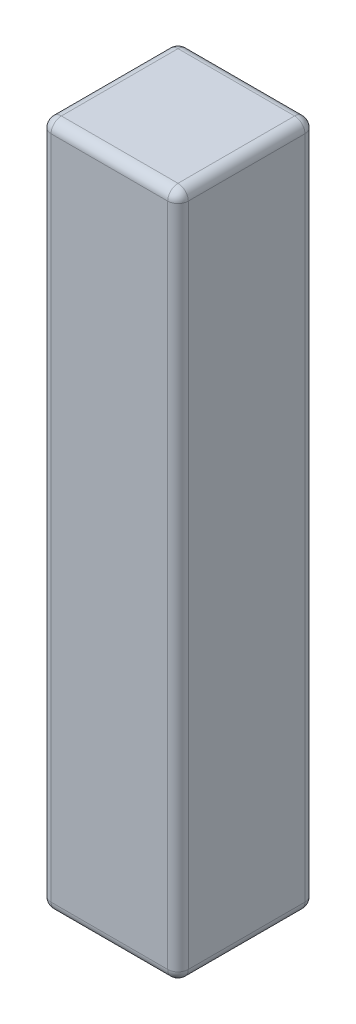
ISO-10303-21;
HEADER;
FILE_DESCRIPTION(('STEP AP214'),'2;1');
FILE_NAME('part.step','',(''),(''),'','','');
FILE_SCHEMA(('AUTOMOTIVE_DESIGN { 1 0 10303 214 1 1 1 1 }'));
ENDSEC;
DATA;
#1=APPLICATION_CONTEXT('core data for automotive mechanical design processes');
#2=APPLICATION_PROTOCOL_DEFINITION('international standard','automotive_design',2000,#1);
#3=PRODUCT_CONTEXT('',#1,'mechanical');
#4=PRODUCT('Part','Part','',(#3));
#5=PRODUCT_RELATED_PRODUCT_CATEGORY('part','',(#4));
#6=PRODUCT_DEFINITION_FORMATION('','',#4);
#7=PRODUCT_DEFINITION_CONTEXT('part definition',#1,'design');
#8=PRODUCT_DEFINITION('design','',#6,#7);
#9=PRODUCT_DEFINITION_SHAPE('','',#8);
#10=(LENGTH_UNIT() NAMED_UNIT(*) SI_UNIT(.MILLI.,.METRE.));
#11=(NAMED_UNIT(*) PLANE_ANGLE_UNIT() SI_UNIT($,.RADIAN.));
#12=(NAMED_UNIT(*) SI_UNIT($,.STERADIAN.) SOLID_ANGLE_UNIT());
#13=UNCERTAINTY_MEASURE_WITH_UNIT(LENGTH_MEASURE(1.E-05),#10,'distance_accuracy_value','');
#14=(GEOMETRIC_REPRESENTATION_CONTEXT(3) GLOBAL_UNCERTAINTY_ASSIGNED_CONTEXT((#13)) GLOBAL_UNIT_ASSIGNED_CONTEXT((#10,
#11,#12)) REPRESENTATION_CONTEXT('',''));
#15=CARTESIAN_POINT('',(0.,0.,0.));
#16=DIRECTION('',(0.,0.,1.));
#17=DIRECTION('',(1.,0.,0.));
#18=AXIS2_PLACEMENT_3D('',#15,#16,#17);
#19=CARTESIAN_POINT('',(-1.00000054,5.,-1.00000054));
#20=DIRECTION('',(1.,0.,0.));
#21=DIRECTION('',(0.,0.,-1.));
#22=AXIS2_PLACEMENT_3D('',#19,#20,#21);
#23=PLANE('',#22);
#24=DIRECTION('',(0.,-1.,0.));
#25=VECTOR('',#24,1.);
#26=CARTESIAN_POINT('',(-1.00000054,5.,0.85000054));
#27=LINE('',#26,#25);
#28=CARTESIAN_POINT('',(-1.00000054,-4.85,0.85000054));
#29=VERTEX_POINT('',#28);
#30=CARTESIAN_POINT('',(-1.00000054,4.85,0.85000054));
#31=VERTEX_POINT('',#30);
#32=EDGE_CURVE('E218',#29,#31,#27,.F.);
#33=ORIENTED_EDGE('',*,*,#32,.T.);
#34=DIRECTION('',(0.,0.,1.));
#35=VECTOR('',#34,1.);
#36=CARTESIAN_POINT('',(-1.00000054,4.85,-1.00000054));
#37=LINE('',#36,#35);
#38=CARTESIAN_POINT('',(-1.00000054,4.85,-0.85000054));
#39=VERTEX_POINT('',#38);
#40=EDGE_CURVE('E221',#31,#39,#37,.F.);
#41=ORIENTED_EDGE('',*,*,#40,.T.);
#42=DIRECTION('',(0.,-1.,0.));
#43=VECTOR('',#42,1.);
#44=CARTESIAN_POINT('',(-1.00000054,5.,-0.85000054));
#45=LINE('',#44,#43);
#46=CARTESIAN_POINT('',(-1.00000054,-4.85,-0.85000054));
#47=VERTEX_POINT('',#46);
#48=EDGE_CURVE('E219',#39,#47,#45,.T.);
#49=ORIENTED_EDGE('',*,*,#48,.T.);
#50=DIRECTION('',(0.,0.,1.));
#51=VECTOR('',#50,1.);
#52=CARTESIAN_POINT('',(-1.00000054,-4.85,-1.00000054));
#53=LINE('',#52,#51);
#54=EDGE_CURVE('E215',#47,#29,#53,.T.);
#55=ORIENTED_EDGE('',*,*,#54,.T.);
#56=EDGE_LOOP('',(#33,#41,#49,#55));
#57=FACE_BOUND('',#56,.T.);
#58=ADVANCED_FACE('F36',(#57),#23,.F.);
#59=CARTESIAN_POINT('',(-1.00000054,5.,1.00000054));
#60=DIRECTION('',(0.,0.,-1.));
#61=DIRECTION('',(-1.,0.,0.));
#62=AXIS2_PLACEMENT_3D('',#59,#60,#61);
#63=PLANE('',#62);
#64=DIRECTION('',(1.,0.,0.));
#65=VECTOR('',#64,1.);
#66=CARTESIAN_POINT('',(-1.00000054,-4.85,1.00000054));
#67=LINE('',#66,#65);
#68=CARTESIAN_POINT('',(-0.85000054,-4.85,1.00000054));
#69=VERTEX_POINT('',#68);
#70=CARTESIAN_POINT('',(0.85000054,-4.85,1.00000054));
#71=VERTEX_POINT('',#70);
#72=EDGE_CURVE('E259',#69,#71,#67,.T.);
#73=ORIENTED_EDGE('',*,*,#72,.T.);
#74=DIRECTION('',(0.,-1.,0.));
#75=VECTOR('',#74,1.);
#76=CARTESIAN_POINT('',(0.85000054,5.,1.00000054));
#77=LINE('',#76,#75);
#78=CARTESIAN_POINT('',(0.85000054,4.85,1.00000054));
#79=VERTEX_POINT('',#78);
#80=EDGE_CURVE('E265',#71,#79,#77,.F.);
#81=ORIENTED_EDGE('',*,*,#80,.T.);
#82=DIRECTION('',(1.,0.,0.));
#83=VECTOR('',#82,1.);
#84=CARTESIAN_POINT('',(-1.00000054,4.85,1.00000054));
#85=LINE('',#84,#83);
#86=CARTESIAN_POINT('',(-0.85000054,4.85,1.00000054));
#87=VERTEX_POINT('',#86);
#88=EDGE_CURVE('E262',#79,#87,#85,.F.);
#89=ORIENTED_EDGE('',*,*,#88,.T.);
#90=DIRECTION('',(0.,-1.,0.));
#91=VECTOR('',#90,1.);
#92=CARTESIAN_POINT('',(-0.85000054,5.,1.00000054));
#93=LINE('',#92,#91);
#94=EDGE_CURVE('E254',#87,#69,#93,.T.);
#95=ORIENTED_EDGE('',*,*,#94,.T.);
#96=EDGE_LOOP('',(#73,#81,#89,#95));
#97=FACE_BOUND('',#96,.T.);
#98=ADVANCED_FACE('F263',(#97),#63,.F.);
#99=CARTESIAN_POINT('',(1.00000054,5.,-1.00000054));
#100=DIRECTION('',(-1.,0.,0.));
#101=DIRECTION('',(0.,0.,1.));
#102=AXIS2_PLACEMENT_3D('',#99,#100,#101);
#103=PLANE('',#102);
#104=DIRECTION('',(0.,0.,-1.));
#105=VECTOR('',#104,1.);
#106=CARTESIAN_POINT('',(1.00000054,4.85,1.00000054));
#107=LINE('',#106,#105);
#108=CARTESIAN_POINT('',(1.00000054,4.85,-0.85000054));
#109=VERTEX_POINT('',#108);
#110=CARTESIAN_POINT('',(1.00000054,4.85,0.85000054));
#111=VERTEX_POINT('',#110);
#112=EDGE_CURVE('E155',#109,#111,#107,.F.);
#113=ORIENTED_EDGE('',*,*,#112,.T.);
#114=DIRECTION('',(0.,-1.,0.));
#115=VECTOR('',#114,1.);
#116=CARTESIAN_POINT('',(1.00000054,5.,0.85000054));
#117=LINE('',#116,#115);
#118=CARTESIAN_POINT('',(1.00000054,-4.85,0.85000054));
#119=VERTEX_POINT('',#118);
#120=EDGE_CURVE('E223',#111,#119,#117,.T.);
#121=ORIENTED_EDGE('',*,*,#120,.T.);
#122=DIRECTION('',(0.,0.,-1.));
#123=VECTOR('',#122,1.);
#124=CARTESIAN_POINT('',(1.00000054,-4.85,-1.00000054));
#125=LINE('',#124,#123);
#126=CARTESIAN_POINT('',(1.00000054,-4.85,-0.85000054));
#127=VERTEX_POINT('',#126);
#128=EDGE_CURVE('E282',#119,#127,#125,.T.);
#129=ORIENTED_EDGE('',*,*,#128,.T.);
#130=DIRECTION('',(0.,-1.,0.));
#131=VECTOR('',#130,1.);
#132=CARTESIAN_POINT('',(1.00000054,5.,-0.85000054));
#133=LINE('',#132,#131);
#134=EDGE_CURVE('E280',#127,#109,#133,.F.);
#135=ORIENTED_EDGE('',*,*,#134,.T.);
#136=EDGE_LOOP('',(#113,#121,#129,#135));
#137=FACE_BOUND('',#136,.T.);
#138=ADVANCED_FACE('F287',(#137),#103,.F.);
#139=CARTESIAN_POINT('',(-1.00000054,5.,-1.00000054));
#140=DIRECTION('',(0.,0.,1.));
#141=DIRECTION('',(1.,0.,0.));
#142=AXIS2_PLACEMENT_3D('',#139,#140,#141);
#143=PLANE('',#142);
#144=DIRECTION('',(-1.,0.,0.));
#145=VECTOR('',#144,1.);
#146=CARTESIAN_POINT('',(1.00000054,4.85,-1.00000054));
#147=LINE('',#146,#145);
#148=CARTESIAN_POINT('',(-0.85000054,4.85,-1.00000054));
#149=VERTEX_POINT('',#148);
#150=CARTESIAN_POINT('',(0.85000054,4.85,-1.00000054));
#151=VERTEX_POINT('',#150);
#152=EDGE_CURVE('E45',#149,#151,#147,.F.);
#153=ORIENTED_EDGE('',*,*,#152,.T.);
#154=DIRECTION('',(0.,-1.,0.));
#155=VECTOR('',#154,1.);
#156=CARTESIAN_POINT('',(0.85000054,5.,-1.00000054));
#157=LINE('',#156,#155);
#158=CARTESIAN_POINT('',(0.85000054,-4.85,-1.00000054));
#159=VERTEX_POINT('',#158);
#160=EDGE_CURVE('E11',#151,#159,#157,.T.);
#161=ORIENTED_EDGE('',*,*,#160,.T.);
#162=DIRECTION('',(-1.,0.,0.));
#163=VECTOR('',#162,1.);
#164=CARTESIAN_POINT('',(-1.00000054,-4.85,-1.00000054));
#165=LINE('',#164,#163);
#166=CARTESIAN_POINT('',(-0.85000054,-4.85,-1.00000054));
#167=VERTEX_POINT('',#166);
#168=EDGE_CURVE('E229',#159,#167,#165,.T.);
#169=ORIENTED_EDGE('',*,*,#168,.T.);
#170=DIRECTION('',(0.,-1.,0.));
#171=VECTOR('',#170,1.);
#172=CARTESIAN_POINT('',(-0.85000054,5.,-1.00000054));
#173=LINE('',#172,#171);
#174=EDGE_CURVE('E56',#167,#149,#173,.F.);
#175=ORIENTED_EDGE('',*,*,#174,.T.);
#176=EDGE_LOOP('',(#153,#161,#169,#175));
#177=FACE_BOUND('',#176,.T.);
#178=ADVANCED_FACE('F358',(#177),#143,.F.);
#179=CARTESIAN_POINT('',(-1.00000054,5.,1.00000054));
#180=DIRECTION('',(0.,1.,0.));
#181=DIRECTION('',(0.,0.,1.));
#182=AXIS2_PLACEMENT_3D('',#179,#180,#181);
#183=PLANE('',#182);
#184=DIRECTION('',(0.,0.,1.));
#185=VECTOR('',#184,1.);
#186=CARTESIAN_POINT('',(-0.85000054,5.,1.00000054));
#187=LINE('',#186,#185);
#188=CARTESIAN_POINT('',(-0.85000054,5.,-0.85000054));
#189=VERTEX_POINT('',#188);
#190=CARTESIAN_POINT('',(-0.85000054,5.,0.85000054));
#191=VERTEX_POINT('',#190);
#192=EDGE_CURVE('E134',#189,#191,#187,.T.);
#193=ORIENTED_EDGE('',*,*,#192,.T.);
#194=DIRECTION('',(1.,0.,0.));
#195=VECTOR('',#194,1.);
#196=CARTESIAN_POINT('',(1.00000054,5.,0.85000054));
#197=LINE('',#196,#195);
#198=CARTESIAN_POINT('',(0.85000054,5.,0.85000054));
#199=VERTEX_POINT('',#198);
#200=EDGE_CURVE('E130',#191,#199,#197,.T.);
#201=ORIENTED_EDGE('',*,*,#200,.T.);
#202=DIRECTION('',(0.,0.,-1.));
#203=VECTOR('',#202,1.);
#204=CARTESIAN_POINT('',(0.85000054,5.,-1.00000054));
#205=LINE('',#204,#203);
#206=CARTESIAN_POINT('',(0.85000054,5.,-0.85000054));
#207=VERTEX_POINT('',#206);
#208=EDGE_CURVE('E124',#199,#207,#205,.T.);
#209=ORIENTED_EDGE('',*,*,#208,.T.);
#210=DIRECTION('',(-1.,0.,0.));
#211=VECTOR('',#210,1.);
#212=CARTESIAN_POINT('',(-1.00000054,5.,-0.85000054));
#213=LINE('',#212,#211);
#214=EDGE_CURVE('E127',#207,#189,#213,.T.);
#215=ORIENTED_EDGE('',*,*,#214,.T.);
#216=EDGE_LOOP('',(#193,#201,#209,#215));
#217=FACE_BOUND('',#216,.T.);
#218=ADVANCED_FACE('F126',(#217),#183,.T.);
#219=CARTESIAN_POINT('',(-1.00000054,-5.,1.00000054));
#220=DIRECTION('',(0.,1.,0.));
#221=DIRECTION('',(0.,0.,1.));
#222=AXIS2_PLACEMENT_3D('',#219,#220,#221);
#223=PLANE('',#222);
#224=DIRECTION('',(0.,0.,-1.));
#225=VECTOR('',#224,1.);
#226=CARTESIAN_POINT('',(0.85000054,-5.,1.00000054));
#227=LINE('',#226,#225);
#228=CARTESIAN_POINT('',(0.85000054,-5.,-0.85000054));
#229=VERTEX_POINT('',#228);
#230=CARTESIAN_POINT('',(0.85000054,-5.,0.85000054));
#231=VERTEX_POINT('',#230);
#232=EDGE_CURVE('E276',#229,#231,#227,.F.);
#233=ORIENTED_EDGE('',*,*,#232,.T.);
#234=DIRECTION('',(1.,0.,0.));
#235=VECTOR('',#234,1.);
#236=CARTESIAN_POINT('',(-1.00000054,-5.,0.85000054));
#237=LINE('',#236,#235);
#238=CARTESIAN_POINT('',(-0.85000054,-5.,0.85000054));
#239=VERTEX_POINT('',#238);
#240=EDGE_CURVE('E278',#231,#239,#237,.F.);
#241=ORIENTED_EDGE('',*,*,#240,.T.);
#242=DIRECTION('',(0.,0.,1.));
#243=VECTOR('',#242,1.);
#244=CARTESIAN_POINT('',(-0.85000054,-5.,1.00000054));
#245=LINE('',#244,#243);
#246=CARTESIAN_POINT('',(-0.85000054,-5.,-0.85000054));
#247=VERTEX_POINT('',#246);
#248=EDGE_CURVE('E213',#239,#247,#245,.F.);
#249=ORIENTED_EDGE('',*,*,#248,.T.);
#250=DIRECTION('',(-1.,0.,0.));
#251=VECTOR('',#250,1.);
#252=CARTESIAN_POINT('',(-1.00000054,-5.,-0.85000054));
#253=LINE('',#252,#251);
#254=EDGE_CURVE('E270',#247,#229,#253,.F.);
#255=ORIENTED_EDGE('',*,*,#254,.T.);
#256=EDGE_LOOP('',(#233,#241,#249,#255));
#257=FACE_BOUND('',#256,.T.);
#258=ADVANCED_FACE('F359',(#257),#223,.F.);
#259=CARTESIAN_POINT('',(-1.00000054,-4.85,-0.85000054));
#260=DIRECTION('',(-1.,0.,0.));
#261=DIRECTION('',(0.,0.,1.));
#262=AXIS2_PLACEMENT_3D('',#259,#260,#261);
#263=CYLINDRICAL_SURFACE('',#262,0.15);
#264=CARTESIAN_POINT('',(-0.85000054,-4.85,-0.85000054));
#265=DIRECTION('',(-1.,0.,0.));
#266=DIRECTION('',(0.,0.,1.));
#267=AXIS2_PLACEMENT_3D('',#264,#265,#266);
#268=CIRCLE('',#267,0.15);
#269=EDGE_CURVE('E40',#167,#247,#268,.T.);
#270=ORIENTED_EDGE('',*,*,#269,.F.);
#271=ORIENTED_EDGE('',*,*,#168,.F.);
#272=CARTESIAN_POINT('',(0.85000054,-4.85,-0.85000054));
#273=DIRECTION('',(1.,0.,0.));
#274=DIRECTION('',(0.,0.,-1.));
#275=AXIS2_PLACEMENT_3D('',#272,#273,#274);
#276=CIRCLE('',#275,0.15);
#277=EDGE_CURVE('E193',#229,#159,#276,.T.);
#278=ORIENTED_EDGE('',*,*,#277,.F.);
#279=ORIENTED_EDGE('',*,*,#254,.F.);
#280=EDGE_LOOP('',(#270,#271,#278,#279));
#281=FACE_BOUND('',#280,.T.);
#282=ADVANCED_FACE('F38',(#281),#263,.T.);
#283=CARTESIAN_POINT('',(-0.85000054,-4.85,-0.85000054));
#284=DIRECTION('',(0.,0.,1.));
#285=DIRECTION('',(1.,0.,0.));
#286=AXIS2_PLACEMENT_3D('',#283,#284,#285);
#287=SPHERICAL_SURFACE('',#286,0.15);
#288=CARTESIAN_POINT('',(-0.85000054,-4.85,-0.85000054));
#289=DIRECTION('',(0.,-1.,0.));
#290=DIRECTION('',(0.,0.,-1.));
#291=AXIS2_PLACEMENT_3D('',#288,#289,#290);
#292=CIRCLE('',#291,0.15);
#293=EDGE_CURVE('E188',#167,#47,#292,.F.);
#294=ORIENTED_EDGE('',*,*,#293,.F.);
#295=ORIENTED_EDGE('',*,*,#269,.T.);
#296=CARTESIAN_POINT('',(-0.85000054,-4.85,-0.85000054));
#297=DIRECTION('',(0.,0.,-1.));
#298=DIRECTION('',(-1.,0.,0.));
#299=AXIS2_PLACEMENT_3D('',#296,#297,#298);
#300=CIRCLE('',#299,0.15);
#301=EDGE_CURVE('E191',#47,#247,#300,.F.);
#302=ORIENTED_EDGE('',*,*,#301,.F.);
#303=EDGE_LOOP('',(#294,#295,#302));
#304=FACE_BOUND('',#303,.T.);
#305=ADVANCED_FACE('F205',(#304),#287,.T.);
#306=CARTESIAN_POINT('',(0.85000054,-4.85,-0.85000054));
#307=DIRECTION('',(0.,0.,1.));
#308=DIRECTION('',(1.,0.,0.));
#309=AXIS2_PLACEMENT_3D('',#306,#307,#308);
#310=SPHERICAL_SURFACE('',#309,0.15);
#311=CARTESIAN_POINT('',(0.85000054,-4.85,-0.85000054));
#312=DIRECTION('',(0.,0.,-1.));
#313=DIRECTION('',(-1.,0.,0.));
#314=AXIS2_PLACEMENT_3D('',#311,#312,#313);
#315=CIRCLE('',#314,0.15);
#316=EDGE_CURVE('E183',#229,#127,#315,.F.);
#317=ORIENTED_EDGE('',*,*,#316,.F.);
#318=ORIENTED_EDGE('',*,*,#277,.T.);
#319=CARTESIAN_POINT('',(0.85000054,-4.85,-0.85000054));
#320=DIRECTION('',(0.,-1.,0.));
#321=DIRECTION('',(0.,0.,-1.));
#322=AXIS2_PLACEMENT_3D('',#319,#320,#321);
#323=CIRCLE('',#322,0.15);
#324=EDGE_CURVE('E186',#127,#159,#323,.F.);
#325=ORIENTED_EDGE('',*,*,#324,.F.);
#326=EDGE_LOOP('',(#317,#318,#325));
#327=FACE_BOUND('',#326,.T.);
#328=ADVANCED_FACE('F355',(#327),#310,.T.);
#329=CARTESIAN_POINT('',(-0.85000054,-4.85,-1.00000054));
#330=DIRECTION('',(0.,0.,1.));
#331=DIRECTION('',(1.,0.,0.));
#332=AXIS2_PLACEMENT_3D('',#329,#330,#331);
#333=CYLINDRICAL_SURFACE('',#332,0.15);
#334=ORIENTED_EDGE('',*,*,#301,.T.);
#335=ORIENTED_EDGE('',*,*,#248,.F.);
#336=CARTESIAN_POINT('',(-0.85000054,-4.85,0.85000054));
#337=DIRECTION('',(0.,0.,1.));
#338=DIRECTION('',(1.,0.,0.));
#339=AXIS2_PLACEMENT_3D('',#336,#337,#338);
#340=CIRCLE('',#339,0.15);
#341=EDGE_CURVE('E178',#29,#239,#340,.T.);
#342=ORIENTED_EDGE('',*,*,#341,.F.);
#343=ORIENTED_EDGE('',*,*,#54,.F.);
#344=EDGE_LOOP('',(#334,#335,#342,#343));
#345=FACE_BOUND('',#344,.T.);
#346=ADVANCED_FACE('F211',(#345),#333,.T.);
#347=CARTESIAN_POINT('',(-0.85000054,5.,-0.85000054));
#348=DIRECTION('',(0.,-1.,0.));
#349=DIRECTION('',(0.,0.,-1.));
#350=AXIS2_PLACEMENT_3D('',#347,#348,#349);
#351=CYLINDRICAL_SURFACE('',#350,0.15);
#352=ORIENTED_EDGE('',*,*,#293,.T.);
#353=ORIENTED_EDGE('',*,*,#48,.F.);
#354=CARTESIAN_POINT('',(-0.85000054,4.85,-0.85000054));
#355=DIRECTION('',(0.,1.,0.));
#356=DIRECTION('',(0.,0.,1.));
#357=AXIS2_PLACEMENT_3D('',#354,#355,#356);
#358=CIRCLE('',#357,0.15);
#359=EDGE_CURVE('E175',#149,#39,#358,.T.);
#360=ORIENTED_EDGE('',*,*,#359,.F.);
#361=ORIENTED_EDGE('',*,*,#174,.F.);
#362=EDGE_LOOP('',(#352,#353,#360,#361));
#363=FACE_BOUND('',#362,.T.);
#364=ADVANCED_FACE('F304',(#363),#351,.T.);
#365=CARTESIAN_POINT('',(-1.00000054,4.85,-0.85000054));
#366=DIRECTION('',(1.,0.,0.));
#367=DIRECTION('',(0.,0.,-1.));
#368=AXIS2_PLACEMENT_3D('',#365,#366,#367);
#369=CYLINDRICAL_SURFACE('',#368,0.15);
#370=CARTESIAN_POINT('',(0.85000054,4.85,-0.85000054));
#371=DIRECTION('',(1.,0.,0.));
#372=DIRECTION('',(0.,0.,-1.));
#373=AXIS2_PLACEMENT_3D('',#370,#371,#372);
#374=CIRCLE('',#373,0.15);
#375=EDGE_CURVE('E140',#151,#207,#374,.T.);
#376=ORIENTED_EDGE('',*,*,#375,.F.);
#377=ORIENTED_EDGE('',*,*,#152,.F.);
#378=CARTESIAN_POINT('',(-0.85000054,4.85,-0.85000054));
#379=DIRECTION('',(-1.,0.,0.));
#380=DIRECTION('',(0.,0.,1.));
#381=AXIS2_PLACEMENT_3D('',#378,#379,#380);
#382=CIRCLE('',#381,0.15);
#383=EDGE_CURVE('E143',#189,#149,#382,.T.);
#384=ORIENTED_EDGE('',*,*,#383,.F.);
#385=ORIENTED_EDGE('',*,*,#214,.F.);
#386=EDGE_LOOP('',(#376,#377,#384,#385));
#387=FACE_BOUND('',#386,.T.);
#388=ADVANCED_FACE('F139',(#387),#369,.T.);
#389=CARTESIAN_POINT('',(0.85000054,5.,-0.85000054));
#390=DIRECTION('',(0.,-1.,0.));
#391=DIRECTION('',(0.,0.,-1.));
#392=AXIS2_PLACEMENT_3D('',#389,#390,#391);
#393=CYLINDRICAL_SURFACE('',#392,0.15);
#394=ORIENTED_EDGE('',*,*,#324,.T.);
#395=ORIENTED_EDGE('',*,*,#160,.F.);
#396=CARTESIAN_POINT('',(0.85000054,4.85,-0.85000054));
#397=DIRECTION('',(0.,1.,0.));
#398=DIRECTION('',(0.,0.,1.));
#399=AXIS2_PLACEMENT_3D('',#396,#397,#398);
#400=CIRCLE('',#399,0.15);
#401=EDGE_CURVE('E152',#109,#151,#400,.T.);
#402=ORIENTED_EDGE('',*,*,#401,.F.);
#403=ORIENTED_EDGE('',*,*,#134,.F.);
#404=EDGE_LOOP('',(#394,#395,#402,#403));
#405=FACE_BOUND('',#404,.T.);
#406=ADVANCED_FACE('F357',(#405),#393,.T.);
#407=CARTESIAN_POINT('',(0.85000054,-4.85,-1.00000054));
#408=DIRECTION('',(0.,0.,-1.));
#409=DIRECTION('',(-1.,0.,0.));
#410=AXIS2_PLACEMENT_3D('',#407,#408,#409);
#411=CYLINDRICAL_SURFACE('',#410,0.15);
#412=ORIENTED_EDGE('',*,*,#316,.T.);
#413=ORIENTED_EDGE('',*,*,#128,.F.);
#414=CARTESIAN_POINT('',(0.85000054,-4.85,0.85000054));
#415=DIRECTION('',(0.,0.,1.));
#416=DIRECTION('',(1.,0.,0.));
#417=AXIS2_PLACEMENT_3D('',#414,#415,#416);
#418=CIRCLE('',#417,0.15);
#419=EDGE_CURVE('E170',#231,#119,#418,.T.);
#420=ORIENTED_EDGE('',*,*,#419,.F.);
#421=ORIENTED_EDGE('',*,*,#232,.F.);
#422=EDGE_LOOP('',(#412,#413,#420,#421));
#423=FACE_BOUND('',#422,.T.);
#424=ADVANCED_FACE('F353',(#423),#411,.T.);
#425=CARTESIAN_POINT('',(-1.00000054,-4.85,0.85000054));
#426=DIRECTION('',(1.,0.,0.));
#427=DIRECTION('',(0.,0.,-1.));
#428=AXIS2_PLACEMENT_3D('',#425,#426,#427);
#429=CYLINDRICAL_SURFACE('',#428,0.15);
#430=CARTESIAN_POINT('',(-0.85000054,-4.85,0.85000054));
#431=DIRECTION('',(-1.,0.,0.));
#432=DIRECTION('',(0.,0.,1.));
#433=AXIS2_PLACEMENT_3D('',#430,#431,#432);
#434=CIRCLE('',#433,0.15);
#435=EDGE_CURVE('E180',#239,#69,#434,.T.);
#436=ORIENTED_EDGE('',*,*,#435,.F.);
#437=ORIENTED_EDGE('',*,*,#240,.F.);
#438=CARTESIAN_POINT('',(0.85000054,-4.85,0.85000054));
#439=DIRECTION('',(1.,0.,0.));
#440=DIRECTION('',(0.,0.,-1.));
#441=AXIS2_PLACEMENT_3D('',#438,#439,#440);
#442=CIRCLE('',#441,0.15);
#443=EDGE_CURVE('E167',#71,#231,#442,.T.);
#444=ORIENTED_EDGE('',*,*,#443,.F.);
#445=ORIENTED_EDGE('',*,*,#72,.F.);
#446=EDGE_LOOP('',(#436,#437,#444,#445));
#447=FACE_BOUND('',#446,.T.);
#448=ADVANCED_FACE('F316',(#447),#429,.T.);
#449=CARTESIAN_POINT('',(-0.85000054,-4.85,0.85000054));
#450=DIRECTION('',(0.,0.,1.));
#451=DIRECTION('',(1.,0.,0.));
#452=AXIS2_PLACEMENT_3D('',#449,#450,#451);
#453=SPHERICAL_SURFACE('',#452,0.15);
#454=ORIENTED_EDGE('',*,*,#341,.T.);
#455=ORIENTED_EDGE('',*,*,#435,.T.);
#456=CARTESIAN_POINT('',(-0.85000054,-4.85,0.85000054));
#457=DIRECTION('',(0.,-1.,0.));
#458=DIRECTION('',(0.,0.,-1.));
#459=AXIS2_PLACEMENT_3D('',#456,#457,#458);
#460=CIRCLE('',#459,0.15);
#461=EDGE_CURVE('E159',#29,#69,#460,.F.);
#462=ORIENTED_EDGE('',*,*,#461,.F.);
#463=EDGE_LOOP('',(#454,#455,#462));
#464=FACE_BOUND('',#463,.T.);
#465=ADVANCED_FACE('F308',(#464),#453,.T.);
#466=CARTESIAN_POINT('',(-0.85000054,4.85,-0.85000054));
#467=DIRECTION('',(0.,0.,1.));
#468=DIRECTION('',(1.,0.,0.));
#469=AXIS2_PLACEMENT_3D('',#466,#467,#468);
#470=SPHERICAL_SURFACE('',#469,0.15);
#471=ORIENTED_EDGE('',*,*,#383,.T.);
#472=ORIENTED_EDGE('',*,*,#359,.T.);
#473=CARTESIAN_POINT('',(-0.85000054,4.85,-0.85000054));
#474=DIRECTION('',(0.,0.,-1.));
#475=DIRECTION('',(-1.,0.,0.));
#476=AXIS2_PLACEMENT_3D('',#473,#474,#475);
#477=CIRCLE('',#476,0.15);
#478=EDGE_CURVE('E156',#189,#39,#477,.F.);
#479=ORIENTED_EDGE('',*,*,#478,.F.);
#480=EDGE_LOOP('',(#471,#472,#479));
#481=FACE_BOUND('',#480,.T.);
#482=ADVANCED_FACE('F306',(#481),#470,.T.);
#483=CARTESIAN_POINT('',(0.85000054,4.85,-0.85000054));
#484=DIRECTION('',(0.,0.,1.));
#485=DIRECTION('',(1.,0.,0.));
#486=AXIS2_PLACEMENT_3D('',#483,#484,#485);
#487=SPHERICAL_SURFACE('',#486,0.15);
#488=ORIENTED_EDGE('',*,*,#401,.T.);
#489=ORIENTED_EDGE('',*,*,#375,.T.);
#490=CARTESIAN_POINT('',(0.85000054,4.85,-0.85000054));
#491=DIRECTION('',(0.,0.,-1.));
#492=DIRECTION('',(-1.,0.,0.));
#493=AXIS2_PLACEMENT_3D('',#490,#491,#492);
#494=CIRCLE('',#493,0.15);
#495=EDGE_CURVE('E149',#109,#207,#494,.F.);
#496=ORIENTED_EDGE('',*,*,#495,.F.);
#497=EDGE_LOOP('',(#488,#489,#496));
#498=FACE_BOUND('',#497,.T.);
#499=ADVANCED_FACE('F148',(#498),#487,.T.);
#500=CARTESIAN_POINT('',(0.85000054,-4.85,0.85000054));
#501=DIRECTION('',(0.,0.,1.));
#502=DIRECTION('',(1.,0.,0.));
#503=AXIS2_PLACEMENT_3D('',#500,#501,#502);
#504=SPHERICAL_SURFACE('',#503,0.15);
#505=ORIENTED_EDGE('',*,*,#443,.T.);
#506=ORIENTED_EDGE('',*,*,#419,.T.);
#507=CARTESIAN_POINT('',(0.85000054,-4.85,0.85000054));
#508=DIRECTION('',(0.,-1.,0.));
#509=DIRECTION('',(0.,0.,-1.));
#510=AXIS2_PLACEMENT_3D('',#507,#508,#509);
#511=CIRCLE('',#510,0.15);
#512=EDGE_CURVE('E157',#71,#119,#511,.F.);
#513=ORIENTED_EDGE('',*,*,#512,.F.);
#514=EDGE_LOOP('',(#505,#506,#513));
#515=FACE_BOUND('',#514,.T.);
#516=ADVANCED_FACE('F314',(#515),#504,.T.);
#517=CARTESIAN_POINT('',(-0.85000054,5.,0.85000054));
#518=DIRECTION('',(0.,-1.,0.));
#519=DIRECTION('',(0.,0.,-1.));
#520=AXIS2_PLACEMENT_3D('',#517,#518,#519);
#521=CYLINDRICAL_SURFACE('',#520,0.15);
#522=ORIENTED_EDGE('',*,*,#461,.T.);
#523=ORIENTED_EDGE('',*,*,#94,.F.);
#524=CARTESIAN_POINT('',(-0.85000054,4.85,0.85000054));
#525=DIRECTION('',(0.,1.,0.));
#526=DIRECTION('',(0.,0.,1.));
#527=AXIS2_PLACEMENT_3D('',#524,#525,#526);
#528=CIRCLE('',#527,0.15);
#529=EDGE_CURVE('E161',#31,#87,#528,.T.);
#530=ORIENTED_EDGE('',*,*,#529,.F.);
#531=ORIENTED_EDGE('',*,*,#32,.F.);
#532=EDGE_LOOP('',(#522,#523,#530,#531));
#533=FACE_BOUND('',#532,.T.);
#534=ADVANCED_FACE('F256',(#533),#521,.T.);
#535=CARTESIAN_POINT('',(-0.85000054,4.85,1.00000054));
#536=DIRECTION('',(0.,0.,-1.));
#537=DIRECTION('',(-1.,0.,0.));
#538=AXIS2_PLACEMENT_3D('',#535,#536,#537);
#539=CYLINDRICAL_SURFACE('',#538,0.15);
#540=ORIENTED_EDGE('',*,*,#478,.T.);
#541=ORIENTED_EDGE('',*,*,#40,.F.);
#542=CARTESIAN_POINT('',(-0.85000054,4.85,0.85000054));
#543=DIRECTION('',(0.,0.,1.));
#544=DIRECTION('',(1.,0.,0.));
#545=AXIS2_PLACEMENT_3D('',#542,#543,#544);
#546=CIRCLE('',#545,0.15);
#547=EDGE_CURVE('E243',#191,#31,#546,.T.);
#548=ORIENTED_EDGE('',*,*,#547,.F.);
#549=ORIENTED_EDGE('',*,*,#192,.F.);
#550=EDGE_LOOP('',(#540,#541,#548,#549));
#551=FACE_BOUND('',#550,.T.);
#552=ADVANCED_FACE('F300',(#551),#539,.T.);
#553=CARTESIAN_POINT('',(0.85000054,4.85,1.00000054));
#554=DIRECTION('',(0.,0.,1.));
#555=DIRECTION('',(1.,0.,0.));
#556=AXIS2_PLACEMENT_3D('',#553,#554,#555);
#557=CYLINDRICAL_SURFACE('',#556,0.15);
#558=ORIENTED_EDGE('',*,*,#495,.T.);
#559=ORIENTED_EDGE('',*,*,#208,.F.);
#560=CARTESIAN_POINT('',(0.85000054,4.85,0.85000054));
#561=DIRECTION('',(0.,0.,1.));
#562=DIRECTION('',(1.,0.,0.));
#563=AXIS2_PLACEMENT_3D('',#560,#561,#562);
#564=CIRCLE('',#563,0.15);
#565=EDGE_CURVE('E240',#111,#199,#564,.T.);
#566=ORIENTED_EDGE('',*,*,#565,.F.);
#567=ORIENTED_EDGE('',*,*,#112,.F.);
#568=EDGE_LOOP('',(#558,#559,#566,#567));
#569=FACE_BOUND('',#568,.T.);
#570=ADVANCED_FACE('F154',(#569),#557,.T.);
#571=CARTESIAN_POINT('',(0.85000054,5.,0.85000054));
#572=DIRECTION('',(0.,-1.,0.));
#573=DIRECTION('',(0.,0.,-1.));
#574=AXIS2_PLACEMENT_3D('',#571,#572,#573);
#575=CYLINDRICAL_SURFACE('',#574,0.15);
#576=ORIENTED_EDGE('',*,*,#512,.T.);
#577=ORIENTED_EDGE('',*,*,#120,.F.);
#578=CARTESIAN_POINT('',(0.85000054,4.85,0.85000054));
#579=DIRECTION('',(0.,1.,0.));
#580=DIRECTION('',(0.,0.,1.));
#581=AXIS2_PLACEMENT_3D('',#578,#579,#580);
#582=CIRCLE('',#581,0.15);
#583=EDGE_CURVE('E237',#79,#111,#582,.T.);
#584=ORIENTED_EDGE('',*,*,#583,.F.);
#585=ORIENTED_EDGE('',*,*,#80,.F.);
#586=EDGE_LOOP('',(#576,#577,#584,#585));
#587=FACE_BOUND('',#586,.T.);
#588=ADVANCED_FACE('F290',(#587),#575,.T.);
#589=CARTESIAN_POINT('',(-0.85000054,4.85,0.85000054));
#590=DIRECTION('',(0.,0.,1.));
#591=DIRECTION('',(1.,0.,0.));
#592=AXIS2_PLACEMENT_3D('',#589,#590,#591);
#593=SPHERICAL_SURFACE('',#592,0.15);
#594=ORIENTED_EDGE('',*,*,#547,.T.);
#595=ORIENTED_EDGE('',*,*,#529,.T.);
#596=CARTESIAN_POINT('',(-0.85000054,4.85,0.85000054));
#597=DIRECTION('',(-1.,0.,0.));
#598=DIRECTION('',(0.,0.,1.));
#599=AXIS2_PLACEMENT_3D('',#596,#597,#598);
#600=CIRCLE('',#599,0.15);
#601=EDGE_CURVE('E235',#191,#87,#600,.F.);
#602=ORIENTED_EDGE('',*,*,#601,.F.);
#603=EDGE_LOOP('',(#594,#595,#602));
#604=FACE_BOUND('',#603,.T.);
#605=ADVANCED_FACE('F250',(#604),#593,.T.);
#606=CARTESIAN_POINT('',(0.85000054,4.85,0.85000054));
#607=DIRECTION('',(0.,0.,1.));
#608=DIRECTION('',(1.,0.,0.));
#609=AXIS2_PLACEMENT_3D('',#606,#607,#608);
#610=SPHERICAL_SURFACE('',#609,0.15);
#611=ORIENTED_EDGE('',*,*,#583,.T.);
#612=ORIENTED_EDGE('',*,*,#565,.T.);
#613=CARTESIAN_POINT('',(0.85000054,4.85,0.85000054));
#614=DIRECTION('',(1.,0.,0.));
#615=DIRECTION('',(0.,0.,-1.));
#616=AXIS2_PLACEMENT_3D('',#613,#614,#615);
#617=CIRCLE('',#616,0.15);
#618=EDGE_CURVE('E233',#79,#199,#617,.F.);
#619=ORIENTED_EDGE('',*,*,#618,.F.);
#620=EDGE_LOOP('',(#611,#612,#619));
#621=FACE_BOUND('',#620,.T.);
#622=ADVANCED_FACE('F293',(#621),#610,.T.);
#623=CARTESIAN_POINT('',(-1.00000054,4.85,0.85000054));
#624=DIRECTION('',(-1.,0.,0.));
#625=DIRECTION('',(0.,0.,1.));
#626=AXIS2_PLACEMENT_3D('',#623,#624,#625);
#627=CYLINDRICAL_SURFACE('',#626,0.15);
#628=ORIENTED_EDGE('',*,*,#601,.T.);
#629=ORIENTED_EDGE('',*,*,#88,.F.);
#630=ORIENTED_EDGE('',*,*,#618,.T.);
#631=ORIENTED_EDGE('',*,*,#200,.F.);
#632=EDGE_LOOP('',(#628,#629,#630,#631));
#633=FACE_BOUND('',#632,.T.);
#634=ADVANCED_FACE('F294',(#633),#627,.T.);
#635=CLOSED_SHELL('',(#58,#98,#138,#178,#218,#258,#282,#305,#328,#346,#364,#388,#406,#424,#448,
#465,#482,#499,#516,#534,#552,#570,#588,#605,#622,#634));
#636=MANIFOLD_SOLID_BREP('B2',#635);
#637=ADVANCED_BREP_SHAPE_REPRESENTATION('',(#18,#636),#14);
#638=SHAPE_DEFINITION_REPRESENTATION(#9,#637);
ENDSEC;
END-ISO-10303-21;
